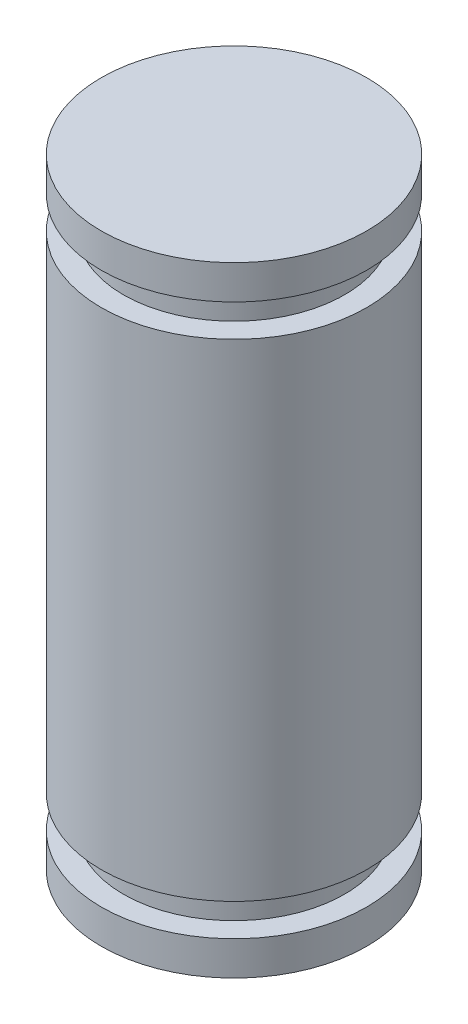
ISO-10303-21;
HEADER;
FILE_DESCRIPTION(('STEP AP214'),'2;1');
FILE_NAME('part.step','',(''),(''),'','','');
FILE_SCHEMA(('AUTOMOTIVE_DESIGN { 1 0 10303 214 1 1 1 1 }'));
ENDSEC;
DATA;
#1=APPLICATION_CONTEXT('core data for automotive mechanical design processes');
#2=APPLICATION_PROTOCOL_DEFINITION('international standard','automotive_design',2000,#1);
#3=PRODUCT_CONTEXT('',#1,'mechanical');
#4=PRODUCT('Part','Part','',(#3));
#5=PRODUCT_RELATED_PRODUCT_CATEGORY('part','',(#4));
#6=PRODUCT_DEFINITION_FORMATION('','',#4);
#7=PRODUCT_DEFINITION_CONTEXT('part definition',#1,'design');
#8=PRODUCT_DEFINITION('design','',#6,#7);
#9=PRODUCT_DEFINITION_SHAPE('','',#8);
#10=(LENGTH_UNIT() NAMED_UNIT(*) SI_UNIT(.MILLI.,.METRE.));
#11=(NAMED_UNIT(*) PLANE_ANGLE_UNIT() SI_UNIT($,.RADIAN.));
#12=(NAMED_UNIT(*) SI_UNIT($,.STERADIAN.) SOLID_ANGLE_UNIT());
#13=UNCERTAINTY_MEASURE_WITH_UNIT(LENGTH_MEASURE(1.E-05),#10,'distance_accuracy_value','');
#14=(GEOMETRIC_REPRESENTATION_CONTEXT(3) GLOBAL_UNCERTAINTY_ASSIGNED_CONTEXT((#13)) GLOBAL_UNIT_ASSIGNED_CONTEXT((#10,
#11,#12)) REPRESENTATION_CONTEXT('',''));
#15=CARTESIAN_POINT('',(0.,0.,0.));
#16=DIRECTION('',(0.,0.,1.));
#17=DIRECTION('',(1.,0.,0.));
#18=AXIS2_PLACEMENT_3D('',#15,#16,#17);
#19=CARTESIAN_POINT('',(-3.,14.,0.));
#20=DIRECTION('',(0.,1.,0.));
#21=DIRECTION('',(0.,0.,1.));
#22=AXIS2_PLACEMENT_3D('',#19,#20,#21);
#23=CYLINDRICAL_SURFACE('',#22,3.);
#24=CARTESIAN_POINT('',(-3.,0.769999999999998,0.));
#25=DIRECTION('',(0.,1.,0.));
#26=DIRECTION('',(0.,0.,1.));
#27=AXIS2_PLACEMENT_3D('',#24,#25,#26);
#28=CIRCLE('',#27,3.);
#29=CARTESIAN_POINT('',(-3.,0.769999999999998,3.));
#30=VERTEX_POINT('',#29);
#31=EDGE_CURVE('E10',#30,#30,#28,.T.);
#32=ORIENTED_EDGE('',*,*,#31,.F.);
#33=EDGE_LOOP('',(#32));
#34=FACE_BOUND('',#33,.T.);
#35=CARTESIAN_POINT('',(-3.,0.,0.));
#36=DIRECTION('',(0.,1.,0.));
#37=DIRECTION('',(0.,0.,1.));
#38=AXIS2_PLACEMENT_3D('',#35,#36,#37);
#39=CIRCLE('',#38,3.);
#40=CARTESIAN_POINT('',(-3.,0.,3.));
#41=VERTEX_POINT('',#40);
#42=EDGE_CURVE('E71',#41,#41,#39,.T.);
#43=ORIENTED_EDGE('',*,*,#42,.T.);
#44=EDGE_LOOP('',(#43));
#45=FACE_BOUND('',#44,.T.);
#46=ADVANCED_FACE('F37',(#34,#45),#23,.T.);
#47=CARTESIAN_POINT('',(-0.499999999999998,0.769999999999998,0.));
#48=DIRECTION('',(0.,-1.,0.));
#49=DIRECTION('',(0.,0.,-1.));
#50=AXIS2_PLACEMENT_3D('',#47,#48,#49);
#51=PLANE('',#50);
#52=CARTESIAN_POINT('',(-3.,0.769999999999998,0.));
#53=DIRECTION('',(0.,1.,0.));
#54=DIRECTION('',(0.,0.,1.));
#55=AXIS2_PLACEMENT_3D('',#52,#53,#54);
#56=CIRCLE('',#55,2.5);
#57=CARTESIAN_POINT('',(-3.,0.769999999999998,2.5));
#58=VERTEX_POINT('',#57);
#59=EDGE_CURVE('E43',#58,#58,#56,.T.);
#60=ORIENTED_EDGE('',*,*,#59,.F.);
#61=EDGE_LOOP('',(#60));
#62=FACE_BOUND('',#61,.T.);
#63=ORIENTED_EDGE('',*,*,#31,.T.);
#64=EDGE_LOOP('',(#63));
#65=FACE_BOUND('',#64,.T.);
#66=ADVANCED_FACE('F87',(#62,#65),#51,.F.);
#67=CARTESIAN_POINT('',(-3.,14.,0.));
#68=DIRECTION('',(0.,1.,0.));
#69=DIRECTION('',(0.,0.,1.));
#70=AXIS2_PLACEMENT_3D('',#67,#68,#69);
#71=CYLINDRICAL_SURFACE('',#70,2.5);
#72=CARTESIAN_POINT('',(-3.,1.5,0.));
#73=DIRECTION('',(0.,1.,0.));
#74=DIRECTION('',(0.,0.,1.));
#75=AXIS2_PLACEMENT_3D('',#72,#73,#74);
#76=CIRCLE('',#75,2.5);
#77=CARTESIAN_POINT('',(-3.,1.5,2.5));
#78=VERTEX_POINT('',#77);
#79=EDGE_CURVE('E47',#78,#78,#76,.T.);
#80=ORIENTED_EDGE('',*,*,#79,.F.);
#81=EDGE_LOOP('',(#80));
#82=FACE_BOUND('',#81,.T.);
#83=ORIENTED_EDGE('',*,*,#59,.T.);
#84=EDGE_LOOP('',(#83));
#85=FACE_BOUND('',#84,.T.);
#86=ADVANCED_FACE('F92',(#82,#85),#71,.T.);
#87=CARTESIAN_POINT('',(0.,1.5,0.));
#88=DIRECTION('',(0.,1.,0.));
#89=DIRECTION('',(0.,0.,1.));
#90=AXIS2_PLACEMENT_3D('',#87,#88,#89);
#91=PLANE('',#90);
#92=CARTESIAN_POINT('',(-3.,1.5,0.));
#93=DIRECTION('',(0.,1.,0.));
#94=DIRECTION('',(0.,0.,1.));
#95=AXIS2_PLACEMENT_3D('',#92,#93,#94);
#96=CIRCLE('',#95,3.);
#97=CARTESIAN_POINT('',(-3.,1.5,3.));
#98=VERTEX_POINT('',#97);
#99=EDGE_CURVE('E51',#98,#98,#96,.T.);
#100=ORIENTED_EDGE('',*,*,#99,.F.);
#101=EDGE_LOOP('',(#100));
#102=FACE_BOUND('',#101,.T.);
#103=ORIENTED_EDGE('',*,*,#79,.T.);
#104=EDGE_LOOP('',(#103));
#105=FACE_BOUND('',#104,.T.);
#106=ADVANCED_FACE('F97',(#102,#105),#91,.F.);
#107=CARTESIAN_POINT('',(-3.,14.,0.));
#108=DIRECTION('',(0.,1.,0.));
#109=DIRECTION('',(0.,0.,1.));
#110=AXIS2_PLACEMENT_3D('',#107,#108,#109);
#111=CYLINDRICAL_SURFACE('',#110,3.);
#112=CARTESIAN_POINT('',(-3.,12.5,0.));
#113=DIRECTION('',(0.,1.,0.));
#114=DIRECTION('',(0.,0.,1.));
#115=AXIS2_PLACEMENT_3D('',#112,#113,#114);
#116=CIRCLE('',#115,3.);
#117=CARTESIAN_POINT('',(-3.,12.5,3.));
#118=VERTEX_POINT('',#117);
#119=EDGE_CURVE('E56',#118,#118,#116,.T.);
#120=ORIENTED_EDGE('',*,*,#119,.F.);
#121=EDGE_LOOP('',(#120));
#122=FACE_BOUND('',#121,.T.);
#123=ORIENTED_EDGE('',*,*,#99,.T.);
#124=EDGE_LOOP('',(#123));
#125=FACE_BOUND('',#124,.T.);
#126=ADVANCED_FACE('F103',(#122,#125),#111,.T.);
#127=CARTESIAN_POINT('',(0.,12.5,0.));
#128=DIRECTION('',(0.,-1.,0.));
#129=DIRECTION('',(0.,0.,-1.));
#130=AXIS2_PLACEMENT_3D('',#127,#128,#129);
#131=PLANE('',#130);
#132=CARTESIAN_POINT('',(-3.,12.5,0.));
#133=DIRECTION('',(0.,1.,0.));
#134=DIRECTION('',(0.,0.,1.));
#135=AXIS2_PLACEMENT_3D('',#132,#133,#134);
#136=CIRCLE('',#135,2.5);
#137=CARTESIAN_POINT('',(-3.,12.5,2.5));
#138=VERTEX_POINT('',#137);
#139=EDGE_CURVE('E59',#138,#138,#136,.T.);
#140=ORIENTED_EDGE('',*,*,#139,.F.);
#141=EDGE_LOOP('',(#140));
#142=FACE_BOUND('',#141,.T.);
#143=ORIENTED_EDGE('',*,*,#119,.T.);
#144=EDGE_LOOP('',(#143));
#145=FACE_BOUND('',#144,.T.);
#146=ADVANCED_FACE('F107',(#142,#145),#131,.F.);
#147=CARTESIAN_POINT('',(-3.,14.,0.));
#148=DIRECTION('',(0.,1.,0.));
#149=DIRECTION('',(0.,0.,1.));
#150=AXIS2_PLACEMENT_3D('',#147,#148,#149);
#151=CYLINDRICAL_SURFACE('',#150,2.5);
#152=CARTESIAN_POINT('',(-3.,13.23,0.));
#153=DIRECTION('',(0.,1.,0.));
#154=DIRECTION('',(0.,0.,1.));
#155=AXIS2_PLACEMENT_3D('',#152,#153,#154);
#156=CIRCLE('',#155,2.5);
#157=CARTESIAN_POINT('',(-3.,13.23,2.5));
#158=VERTEX_POINT('',#157);
#159=EDGE_CURVE('E62',#158,#158,#156,.T.);
#160=ORIENTED_EDGE('',*,*,#159,.F.);
#161=EDGE_LOOP('',(#160));
#162=FACE_BOUND('',#161,.T.);
#163=ORIENTED_EDGE('',*,*,#139,.T.);
#164=EDGE_LOOP('',(#163));
#165=FACE_BOUND('',#164,.T.);
#166=ADVANCED_FACE('F111',(#162,#165),#151,.T.);
#167=CARTESIAN_POINT('',(-0.499999999999999,13.23,0.));
#168=DIRECTION('',(0.,1.,0.));
#169=DIRECTION('',(0.,0.,1.));
#170=AXIS2_PLACEMENT_3D('',#167,#168,#169);
#171=PLANE('',#170);
#172=CARTESIAN_POINT('',(-3.,13.23,0.));
#173=DIRECTION('',(0.,1.,0.));
#174=DIRECTION('',(0.,0.,1.));
#175=AXIS2_PLACEMENT_3D('',#172,#173,#174);
#176=CIRCLE('',#175,3.);
#177=CARTESIAN_POINT('',(-3.,13.23,3.));
#178=VERTEX_POINT('',#177);
#179=EDGE_CURVE('E65',#178,#178,#176,.T.);
#180=ORIENTED_EDGE('',*,*,#179,.F.);
#181=EDGE_LOOP('',(#180));
#182=FACE_BOUND('',#181,.T.);
#183=ORIENTED_EDGE('',*,*,#159,.T.);
#184=EDGE_LOOP('',(#183));
#185=FACE_BOUND('',#184,.T.);
#186=ADVANCED_FACE('F115',(#182,#185),#171,.F.);
#187=CARTESIAN_POINT('',(-3.,14.,0.));
#188=DIRECTION('',(0.,1.,0.));
#189=DIRECTION('',(0.,0.,1.));
#190=AXIS2_PLACEMENT_3D('',#187,#188,#189);
#191=CYLINDRICAL_SURFACE('',#190,3.);
#192=CARTESIAN_POINT('',(-3.,14.,0.));
#193=DIRECTION('',(0.,1.,0.));
#194=DIRECTION('',(0.,0.,1.));
#195=AXIS2_PLACEMENT_3D('',#192,#193,#194);
#196=CIRCLE('',#195,3.);
#197=CARTESIAN_POINT('',(-3.,14.,3.));
#198=VERTEX_POINT('',#197);
#199=EDGE_CURVE('E68',#198,#198,#196,.T.);
#200=ORIENTED_EDGE('',*,*,#199,.F.);
#201=EDGE_LOOP('',(#200));
#202=FACE_BOUND('',#201,.T.);
#203=ORIENTED_EDGE('',*,*,#179,.T.);
#204=EDGE_LOOP('',(#203));
#205=FACE_BOUND('',#204,.T.);
#206=ADVANCED_FACE('F83',(#202,#205),#191,.T.);
#207=CARTESIAN_POINT('',(0.,14.,0.));
#208=DIRECTION('',(0.,-1.,0.));
#209=DIRECTION('',(0.,0.,-1.));
#210=AXIS2_PLACEMENT_3D('',#207,#208,#209);
#211=PLANE('',#210);
#212=ORIENTED_EDGE('',*,*,#199,.T.);
#213=EDGE_LOOP('',(#212));
#214=FACE_BOUND('',#213,.T.);
#215=ADVANCED_FACE('F78',(#214),#211,.F.);
#216=CARTESIAN_POINT('',(-3.,0.,0.));
#217=DIRECTION('',(0.,1.,0.));
#218=DIRECTION('',(0.,0.,1.));
#219=AXIS2_PLACEMENT_3D('',#216,#217,#218);
#220=PLANE('',#219);
#221=ORIENTED_EDGE('',*,*,#42,.F.);
#222=EDGE_LOOP('',(#221));
#223=FACE_BOUND('',#222,.T.);
#224=ADVANCED_FACE('F76',(#223),#220,.F.);
#225=CLOSED_SHELL('',(#46,#66,#86,#106,#126,#146,#166,#186,#206,#215,#224));
#226=MANIFOLD_SOLID_BREP('B2',#225);
#227=ADVANCED_BREP_SHAPE_REPRESENTATION('',(#18,#226),#14);
#228=SHAPE_DEFINITION_REPRESENTATION(#9,#227);
ENDSEC;
END-ISO-10303-21;
